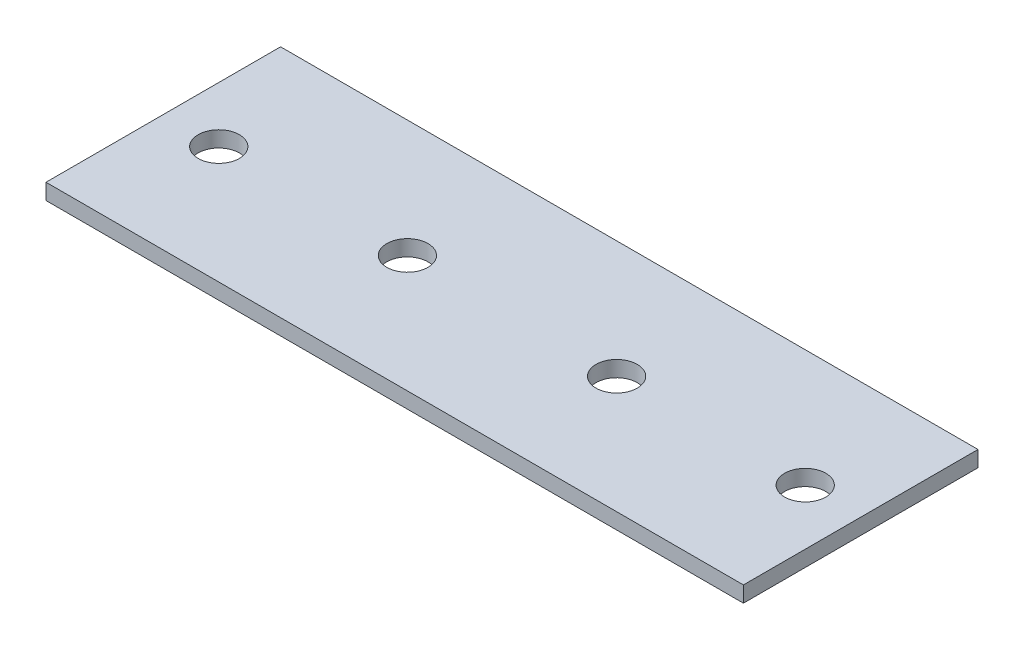
ISO-10303-21;
HEADER;
FILE_DESCRIPTION(('STEP AP214'),'2;1');
FILE_NAME('part.step','',(''),(''),'','','');
FILE_SCHEMA(('AUTOMOTIVE_DESIGN { 1 0 10303 214 1 1 1 1 }'));
ENDSEC;
DATA;
#1=APPLICATION_CONTEXT('core data for automotive mechanical design processes');
#2=APPLICATION_PROTOCOL_DEFINITION('international standard','automotive_design',2000,#1);
#3=PRODUCT_CONTEXT('',#1,'mechanical');
#4=PRODUCT('Part','Part','',(#3));
#5=PRODUCT_RELATED_PRODUCT_CATEGORY('part','',(#4));
#6=PRODUCT_DEFINITION_FORMATION('','',#4);
#7=PRODUCT_DEFINITION_CONTEXT('part definition',#1,'design');
#8=PRODUCT_DEFINITION('design','',#6,#7);
#9=PRODUCT_DEFINITION_SHAPE('','',#8);
#10=(LENGTH_UNIT() NAMED_UNIT(*) SI_UNIT(.MILLI.,.METRE.));
#11=(NAMED_UNIT(*) PLANE_ANGLE_UNIT() SI_UNIT($,.RADIAN.));
#12=(NAMED_UNIT(*) SI_UNIT($,.STERADIAN.) SOLID_ANGLE_UNIT());
#13=UNCERTAINTY_MEASURE_WITH_UNIT(LENGTH_MEASURE(1.E-05),#10,'distance_accuracy_value','');
#14=(GEOMETRIC_REPRESENTATION_CONTEXT(3) GLOBAL_UNCERTAINTY_ASSIGNED_CONTEXT((#13)) GLOBAL_UNIT_ASSIGNED_CONTEXT((#10,
#11,#12)) REPRESENTATION_CONTEXT('',''));
#15=CARTESIAN_POINT('',(0.,0.,0.));
#16=DIRECTION('',(0.,0.,1.));
#17=DIRECTION('',(1.,0.,0.));
#18=AXIS2_PLACEMENT_3D('',#15,#16,#17);
#19=CARTESIAN_POINT('',(0.,5.,0.));
#20=DIRECTION('',(0.,-1.,0.));
#21=DIRECTION('',(0.,0.,-1.));
#22=AXIS2_PLACEMENT_3D('',#19,#20,#21);
#23=PLANE('',#22);
#24=DIRECTION('',(0.,0.,1.));
#25=VECTOR('',#24,1.);
#26=CARTESIAN_POINT('',(0.,5.,0.));
#27=LINE('',#26,#25);
#28=CARTESIAN_POINT('',(0.,5.,-74.));
#29=VERTEX_POINT('',#28);
#30=CARTESIAN_POINT('',(0.,5.,0.));
#31=VERTEX_POINT('',#30);
#32=EDGE_CURVE('E88',#29,#31,#27,.T.);
#33=ORIENTED_EDGE('',*,*,#32,.T.);
#34=DIRECTION('',(1.,0.,0.));
#35=VECTOR('',#34,1.);
#36=CARTESIAN_POINT('',(0.,5.,0.));
#37=LINE('',#36,#35);
#38=CARTESIAN_POINT('',(220.,5.,0.));
#39=VERTEX_POINT('',#38);
#40=EDGE_CURVE('E83',#31,#39,#37,.T.);
#41=ORIENTED_EDGE('',*,*,#40,.T.);
#42=DIRECTION('',(0.,0.,-1.));
#43=VECTOR('',#42,1.);
#44=CARTESIAN_POINT('',(220.,5.,0.));
#45=LINE('',#44,#43);
#46=CARTESIAN_POINT('',(220.,5.,-74.));
#47=VERTEX_POINT('',#46);
#48=EDGE_CURVE('E86',#39,#47,#45,.T.);
#49=ORIENTED_EDGE('',*,*,#48,.T.);
#50=DIRECTION('',(-1.,0.,0.));
#51=VECTOR('',#50,1.);
#52=CARTESIAN_POINT('',(0.,5.,-74.));
#53=LINE('',#52,#51);
#54=EDGE_CURVE('E53',#47,#29,#53,.T.);
#55=ORIENTED_EDGE('',*,*,#54,.T.);
#56=EDGE_LOOP('',(#33,#41,#49,#55));
#57=FACE_BOUND('',#56,.T.);
#58=CARTESIAN_POINT('',(17.5,5.,-37.));
#59=DIRECTION('',(0.,1.,0.));
#60=DIRECTION('',(0.,0.,1.));
#61=AXIS2_PLACEMENT_3D('',#58,#59,#60);
#62=CIRCLE('',#61,6.5);
#63=CARTESIAN_POINT('',(17.5,5.,-30.5));
#64=VERTEX_POINT('',#63);
#65=EDGE_CURVE('E103',#64,#64,#62,.T.);
#66=ORIENTED_EDGE('',*,*,#65,.F.);
#67=EDGE_LOOP('',(#66));
#68=FACE_BOUND('',#67,.T.);
#69=CARTESIAN_POINT('',(77.,5.,-37.));
#70=DIRECTION('',(0.,1.,0.));
#71=DIRECTION('',(0.,0.,1.));
#72=AXIS2_PLACEMENT_3D('',#69,#70,#71);
#73=CIRCLE('',#72,6.49999999999996);
#74=CARTESIAN_POINT('',(77.,5.,-30.5));
#75=VERTEX_POINT('',#74);
#76=EDGE_CURVE('E118',#75,#75,#73,.T.);
#77=ORIENTED_EDGE('',*,*,#76,.F.);
#78=EDGE_LOOP('',(#77));
#79=FACE_BOUND('',#78,.T.);
#80=CARTESIAN_POINT('',(202.5,5.,-37.));
#81=DIRECTION('',(0.,1.,0.));
#82=DIRECTION('',(0.,0.,-1.));
#83=AXIS2_PLACEMENT_3D('',#80,#81,#82);
#84=CIRCLE('',#83,6.49999999999999);
#85=CARTESIAN_POINT('',(202.5,5.,-43.5));
#86=VERTEX_POINT('',#85);
#87=EDGE_CURVE('E124',#86,#86,#84,.T.);
#88=ORIENTED_EDGE('',*,*,#87,.F.);
#89=EDGE_LOOP('',(#88));
#90=FACE_BOUND('',#89,.T.);
#91=CARTESIAN_POINT('',(143.,5.,-37.));
#92=DIRECTION('',(0.,1.,0.));
#93=DIRECTION('',(0.,0.,-1.));
#94=AXIS2_PLACEMENT_3D('',#91,#92,#93);
#95=CIRCLE('',#94,6.49999999999996);
#96=CARTESIAN_POINT('',(143.,5.,-43.5));
#97=VERTEX_POINT('',#96);
#98=EDGE_CURVE('E130',#97,#97,#95,.T.);
#99=ORIENTED_EDGE('',*,*,#98,.F.);
#100=EDGE_LOOP('',(#99));
#101=FACE_BOUND('',#100,.T.);
#102=ADVANCED_FACE('F36',(#57,#68,#79,#90,#101),#23,.F.);
#103=CARTESIAN_POINT('',(0.,0.,0.));
#104=DIRECTION('',(0.,-1.,0.));
#105=DIRECTION('',(0.,0.,-1.));
#106=AXIS2_PLACEMENT_3D('',#103,#104,#105);
#107=PLANE('',#106);
#108=CARTESIAN_POINT('',(202.5,0.,-37.));
#109=DIRECTION('',(0.,1.,0.));
#110=DIRECTION('',(0.,0.,-1.));
#111=AXIS2_PLACEMENT_3D('',#108,#109,#110);
#112=CIRCLE('',#111,6.49999999999999);
#113=CARTESIAN_POINT('',(202.5,0.,-43.5));
#114=VERTEX_POINT('',#113);
#115=EDGE_CURVE('E127',#114,#114,#112,.T.);
#116=ORIENTED_EDGE('',*,*,#115,.T.);
#117=EDGE_LOOP('',(#116));
#118=FACE_BOUND('',#117,.T.);
#119=CARTESIAN_POINT('',(17.5,0.,-37.));
#120=DIRECTION('',(0.,1.,0.));
#121=DIRECTION('',(0.,0.,1.));
#122=AXIS2_PLACEMENT_3D('',#119,#120,#121);
#123=CIRCLE('',#122,6.5);
#124=CARTESIAN_POINT('',(17.5,0.,-30.5));
#125=VERTEX_POINT('',#124);
#126=EDGE_CURVE('E115',#125,#125,#123,.T.);
#127=ORIENTED_EDGE('',*,*,#126,.T.);
#128=EDGE_LOOP('',(#127));
#129=FACE_BOUND('',#128,.T.);
#130=DIRECTION('',(0.,0.,1.));
#131=VECTOR('',#130,1.);
#132=CARTESIAN_POINT('',(0.,0.,0.));
#133=LINE('',#132,#131);
#134=CARTESIAN_POINT('',(0.,0.,-74.));
#135=VERTEX_POINT('',#134);
#136=CARTESIAN_POINT('',(0.,0.,0.));
#137=VERTEX_POINT('',#136);
#138=EDGE_CURVE('E100',#135,#137,#133,.T.);
#139=ORIENTED_EDGE('',*,*,#138,.F.);
#140=DIRECTION('',(-1.,0.,0.));
#141=VECTOR('',#140,1.);
#142=CARTESIAN_POINT('',(0.,0.,-74.));
#143=LINE('',#142,#141);
#144=CARTESIAN_POINT('',(220.,0.,-74.));
#145=VERTEX_POINT('',#144);
#146=EDGE_CURVE('E76',#145,#135,#143,.T.);
#147=ORIENTED_EDGE('',*,*,#146,.F.);
#148=DIRECTION('',(0.,0.,-1.));
#149=VECTOR('',#148,1.);
#150=CARTESIAN_POINT('',(220.,0.,0.));
#151=LINE('',#150,#149);
#152=CARTESIAN_POINT('',(220.,0.,0.));
#153=VERTEX_POINT('',#152);
#154=EDGE_CURVE('E70',#153,#145,#151,.T.);
#155=ORIENTED_EDGE('',*,*,#154,.F.);
#156=DIRECTION('',(1.,0.,0.));
#157=VECTOR('',#156,1.);
#158=CARTESIAN_POINT('',(0.,0.,0.));
#159=LINE('',#158,#157);
#160=EDGE_CURVE('E92',#137,#153,#159,.T.);
#161=ORIENTED_EDGE('',*,*,#160,.F.);
#162=EDGE_LOOP('',(#139,#147,#155,#161));
#163=FACE_BOUND('',#162,.T.);
#164=CARTESIAN_POINT('',(77.,0.,-37.));
#165=DIRECTION('',(0.,1.,0.));
#166=DIRECTION('',(0.,0.,1.));
#167=AXIS2_PLACEMENT_3D('',#164,#165,#166);
#168=CIRCLE('',#167,6.49999999999996);
#169=CARTESIAN_POINT('',(77.,0.,-30.5));
#170=VERTEX_POINT('',#169);
#171=EDGE_CURVE('E121',#170,#170,#168,.T.);
#172=ORIENTED_EDGE('',*,*,#171,.T.);
#173=EDGE_LOOP('',(#172));
#174=FACE_BOUND('',#173,.T.);
#175=CARTESIAN_POINT('',(143.,0.,-37.));
#176=DIRECTION('',(0.,1.,0.));
#177=DIRECTION('',(0.,0.,-1.));
#178=AXIS2_PLACEMENT_3D('',#175,#176,#177);
#179=CIRCLE('',#178,6.49999999999996);
#180=CARTESIAN_POINT('',(143.,0.,-43.5));
#181=VERTEX_POINT('',#180);
#182=EDGE_CURVE('E133',#181,#181,#179,.T.);
#183=ORIENTED_EDGE('',*,*,#182,.T.);
#184=EDGE_LOOP('',(#183));
#185=FACE_BOUND('',#184,.T.);
#186=ADVANCED_FACE('F111',(#118,#129,#163,#174,#185),#107,.T.);
#187=CARTESIAN_POINT('',(0.,5.,0.));
#188=DIRECTION('',(1.,0.,0.));
#189=DIRECTION('',(0.,0.,-1.));
#190=AXIS2_PLACEMENT_3D('',#187,#188,#189);
#191=PLANE('',#190);
#192=ORIENTED_EDGE('',*,*,#138,.T.);
#193=DIRECTION('',(0.,-1.,0.));
#194=VECTOR('',#193,1.);
#195=CARTESIAN_POINT('',(0.,5.,0.));
#196=LINE('',#195,#194);
#197=EDGE_CURVE('E11',#31,#137,#196,.T.);
#198=ORIENTED_EDGE('',*,*,#197,.F.);
#199=ORIENTED_EDGE('',*,*,#32,.F.);
#200=DIRECTION('',(0.,-1.,0.));
#201=VECTOR('',#200,1.);
#202=CARTESIAN_POINT('',(0.,5.,-74.));
#203=LINE('',#202,#201);
#204=EDGE_CURVE('E96',#29,#135,#203,.T.);
#205=ORIENTED_EDGE('',*,*,#204,.T.);
#206=EDGE_LOOP('',(#192,#198,#199,#205));
#207=FACE_BOUND('',#206,.T.);
#208=ADVANCED_FACE('F38',(#207),#191,.F.);
#209=CARTESIAN_POINT('',(0.,5.,0.));
#210=DIRECTION('',(0.,0.,-1.));
#211=DIRECTION('',(-1.,0.,0.));
#212=AXIS2_PLACEMENT_3D('',#209,#210,#211);
#213=PLANE('',#212);
#214=ORIENTED_EDGE('',*,*,#160,.T.);
#215=DIRECTION('',(0.,-1.,0.));
#216=VECTOR('',#215,1.);
#217=CARTESIAN_POINT('',(220.,5.,0.));
#218=LINE('',#217,#216);
#219=EDGE_CURVE('E45',#39,#153,#218,.T.);
#220=ORIENTED_EDGE('',*,*,#219,.F.);
#221=ORIENTED_EDGE('',*,*,#40,.F.);
#222=ORIENTED_EDGE('',*,*,#197,.T.);
#223=EDGE_LOOP('',(#214,#220,#221,#222));
#224=FACE_BOUND('',#223,.T.);
#225=ADVANCED_FACE('F91',(#224),#213,.F.);
#226=CARTESIAN_POINT('',(220.,5.,0.));
#227=DIRECTION('',(-1.,0.,0.));
#228=DIRECTION('',(0.,0.,1.));
#229=AXIS2_PLACEMENT_3D('',#226,#227,#228);
#230=PLANE('',#229);
#231=ORIENTED_EDGE('',*,*,#154,.T.);
#232=DIRECTION('',(0.,-1.,0.));
#233=VECTOR('',#232,1.);
#234=CARTESIAN_POINT('',(220.,5.,-74.));
#235=LINE('',#234,#233);
#236=EDGE_CURVE('E93',#47,#145,#235,.T.);
#237=ORIENTED_EDGE('',*,*,#236,.F.);
#238=ORIENTED_EDGE('',*,*,#48,.F.);
#239=ORIENTED_EDGE('',*,*,#219,.T.);
#240=EDGE_LOOP('',(#231,#237,#238,#239));
#241=FACE_BOUND('',#240,.T.);
#242=ADVANCED_FACE('F94',(#241),#230,.F.);
#243=CARTESIAN_POINT('',(0.,5.,-74.));
#244=DIRECTION('',(0.,0.,1.));
#245=DIRECTION('',(1.,0.,0.));
#246=AXIS2_PLACEMENT_3D('',#243,#244,#245);
#247=PLANE('',#246);
#248=ORIENTED_EDGE('',*,*,#146,.T.);
#249=ORIENTED_EDGE('',*,*,#204,.F.);
#250=ORIENTED_EDGE('',*,*,#54,.F.);
#251=ORIENTED_EDGE('',*,*,#236,.T.);
#252=EDGE_LOOP('',(#248,#249,#250,#251));
#253=FACE_BOUND('',#252,.T.);
#254=ADVANCED_FACE('F108',(#253),#247,.F.);
#255=CARTESIAN_POINT('',(17.5,5.,-37.));
#256=DIRECTION('',(0.,-1.,0.));
#257=DIRECTION('',(0.,0.,-1.));
#258=AXIS2_PLACEMENT_3D('',#255,#256,#257);
#259=CYLINDRICAL_SURFACE('',#258,6.5);
#260=ORIENTED_EDGE('',*,*,#65,.T.);
#261=EDGE_LOOP('',(#260));
#262=FACE_BOUND('',#261,.T.);
#263=ORIENTED_EDGE('',*,*,#126,.F.);
#264=EDGE_LOOP('',(#263));
#265=FACE_BOUND('',#264,.T.);
#266=ADVANCED_FACE('F150',(#262,#265),#259,.F.);
#267=CARTESIAN_POINT('',(77.,5.,-37.));
#268=DIRECTION('',(0.,-1.,0.));
#269=DIRECTION('',(0.,0.,-1.));
#270=AXIS2_PLACEMENT_3D('',#267,#268,#269);
#271=CYLINDRICAL_SURFACE('',#270,6.49999999999996);
#272=ORIENTED_EDGE('',*,*,#76,.T.);
#273=EDGE_LOOP('',(#272));
#274=FACE_BOUND('',#273,.T.);
#275=ORIENTED_EDGE('',*,*,#171,.F.);
#276=EDGE_LOOP('',(#275));
#277=FACE_BOUND('',#276,.T.);
#278=ADVANCED_FACE('F196',(#274,#277),#271,.F.);
#279=CARTESIAN_POINT('',(202.5,5.,-37.));
#280=DIRECTION('',(0.,-1.,0.));
#281=DIRECTION('',(0.,0.,-1.));
#282=AXIS2_PLACEMENT_3D('',#279,#280,#281);
#283=CYLINDRICAL_SURFACE('',#282,6.49999999999999);
#284=ORIENTED_EDGE('',*,*,#87,.T.);
#285=EDGE_LOOP('',(#284));
#286=FACE_BOUND('',#285,.T.);
#287=ORIENTED_EDGE('',*,*,#115,.F.);
#288=EDGE_LOOP('',(#287));
#289=FACE_BOUND('',#288,.T.);
#290=ADVANCED_FACE('F204',(#286,#289),#283,.F.);
#291=CARTESIAN_POINT('',(143.,5.,-37.));
#292=DIRECTION('',(0.,-1.,0.));
#293=DIRECTION('',(0.,0.,-1.));
#294=AXIS2_PLACEMENT_3D('',#291,#292,#293);
#295=CYLINDRICAL_SURFACE('',#294,6.49999999999996);
#296=ORIENTED_EDGE('',*,*,#98,.T.);
#297=EDGE_LOOP('',(#296));
#298=FACE_BOUND('',#297,.T.);
#299=ORIENTED_EDGE('',*,*,#182,.F.);
#300=EDGE_LOOP('',(#299));
#301=FACE_BOUND('',#300,.T.);
#302=ADVANCED_FACE('F139',(#298,#301),#295,.F.);
#303=CLOSED_SHELL('',(#102,#186,#208,#225,#242,#254,#266,#278,#290,#302));
#304=MANIFOLD_SOLID_BREP('B2',#303);
#305=ADVANCED_BREP_SHAPE_REPRESENTATION('',(#18,#304),#14);
#306=SHAPE_DEFINITION_REPRESENTATION(#9,#305);
ENDSEC;
END-ISO-10303-21;
